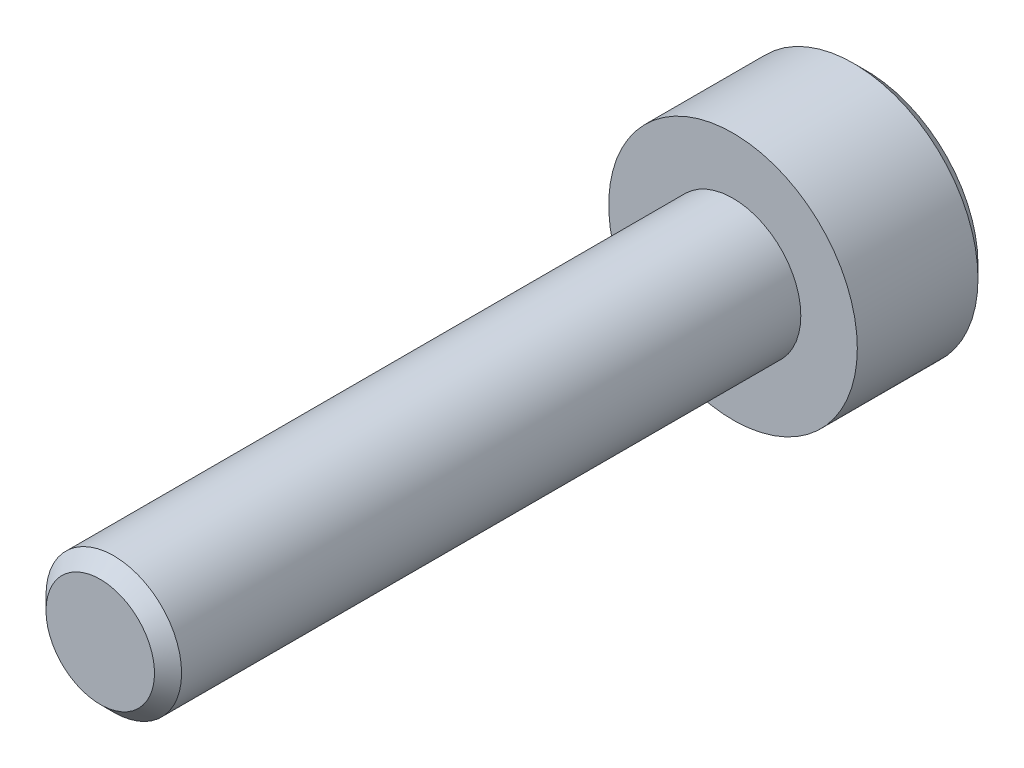
ISO-10303-21;
HEADER;
FILE_DESCRIPTION(('STEP AP214'),'2;1');
FILE_NAME('part.step','',(''),(''),'','','');
FILE_SCHEMA(('AUTOMOTIVE_DESIGN { 1 0 10303 214 1 1 1 1 }'));
ENDSEC;
DATA;
#1=APPLICATION_CONTEXT('core data for automotive mechanical design processes');
#2=APPLICATION_PROTOCOL_DEFINITION('international standard','automotive_design',2000,#1);
#3=PRODUCT_CONTEXT('',#1,'mechanical');
#4=PRODUCT('Part','Part','',(#3));
#5=PRODUCT_RELATED_PRODUCT_CATEGORY('part','',(#4));
#6=PRODUCT_DEFINITION_FORMATION('','',#4);
#7=PRODUCT_DEFINITION_CONTEXT('part definition',#1,'design');
#8=PRODUCT_DEFINITION('design','',#6,#7);
#9=PRODUCT_DEFINITION_SHAPE('','',#8);
#10=(LENGTH_UNIT() NAMED_UNIT(*) SI_UNIT(.MILLI.,.METRE.));
#11=(NAMED_UNIT(*) PLANE_ANGLE_UNIT() SI_UNIT($,.RADIAN.));
#12=(NAMED_UNIT(*) SI_UNIT($,.STERADIAN.) SOLID_ANGLE_UNIT());
#13=UNCERTAINTY_MEASURE_WITH_UNIT(LENGTH_MEASURE(1.E-05),#10,'distance_accuracy_value','');
#14=(GEOMETRIC_REPRESENTATION_CONTEXT(3) GLOBAL_UNCERTAINTY_ASSIGNED_CONTEXT((#13)) GLOBAL_UNIT_ASSIGNED_CONTEXT((#10,
#11,#12)) REPRESENTATION_CONTEXT('',''));
#15=CARTESIAN_POINT('',(0.,0.,0.));
#16=DIRECTION('',(0.,0.,1.));
#17=DIRECTION('',(1.,0.,0.));
#18=AXIS2_PLACEMENT_3D('',#15,#16,#17);
#19=CARTESIAN_POINT('',(0.,0.,-1.445));
#20=DIRECTION('',(0.,0.,1.));
#21=DIRECTION('',(1.,0.,0.));
#22=AXIS2_PLACEMENT_3D('',#19,#20,#21);
#23=PLANE('',#22);
#24=DIRECTION('',(0.,1.,0.));
#25=VECTOR('',#24,1.);
#26=CARTESIAN_POINT('',(1.25,0.721687836487032,-1.445));
#27=LINE('',#26,#25);
#28=CARTESIAN_POINT('',(1.25,0.72168783648703,-1.445));
#29=VERTEX_POINT('',#28);
#30=CARTESIAN_POINT('',(1.25,-0.721687836487032,-1.445));
#31=VERTEX_POINT('',#30);
#32=EDGE_CURVE('E130',#29,#31,#27,.F.);
#33=ORIENTED_EDGE('',*,*,#32,.T.);
#34=DIRECTION('',(0.866025403784439,0.499999999999999,0.));
#35=VECTOR('',#34,1.);
#36=CARTESIAN_POINT('',(1.25,-0.721687836487032,-1.445));
#37=LINE('',#36,#35);
#38=CARTESIAN_POINT('',(0.,-1.44337567297406,-1.445));
#39=VERTEX_POINT('',#38);
#40=EDGE_CURVE('E125',#31,#39,#37,.F.);
#41=ORIENTED_EDGE('',*,*,#40,.T.);
#42=DIRECTION('',(0.866025403784438,-0.5,0.));
#43=VECTOR('',#42,1.);
#44=CARTESIAN_POINT('',(0.,-1.44337567297406,-1.445));
#45=LINE('',#44,#43);
#46=CARTESIAN_POINT('',(-1.25,-0.721687836487031,-1.445));
#47=VERTEX_POINT('',#46);
#48=EDGE_CURVE('E74',#39,#47,#45,.F.);
#49=ORIENTED_EDGE('',*,*,#48,.T.);
#50=DIRECTION('',(0.,1.,0.));
#51=VECTOR('',#50,1.);
#52=CARTESIAN_POINT('',(-1.25,-0.721687836487032,-1.445));
#53=LINE('',#52,#51);
#54=CARTESIAN_POINT('',(-1.25,0.721687836487033,-1.445));
#55=VERTEX_POINT('',#54);
#56=EDGE_CURVE('E71',#47,#55,#53,.T.);
#57=ORIENTED_EDGE('',*,*,#56,.T.);
#58=DIRECTION('',(-0.866025403784439,-0.5,0.));
#59=VECTOR('',#58,1.);
#60=CARTESIAN_POINT('',(-1.25,0.721687836487033,-1.445));
#61=LINE('',#60,#59);
#62=CARTESIAN_POINT('',(0.,1.44337567297406,-1.445));
#63=VERTEX_POINT('',#62);
#64=EDGE_CURVE('E68',#55,#63,#61,.F.);
#65=ORIENTED_EDGE('',*,*,#64,.T.);
#66=DIRECTION('',(-0.866025403784439,0.5,0.));
#67=VECTOR('',#66,1.);
#68=CARTESIAN_POINT('',(0.,1.44337567297406,-1.445));
#69=LINE('',#68,#67);
#70=EDGE_CURVE('E91',#63,#29,#69,.F.);
#71=ORIENTED_EDGE('',*,*,#70,.T.);
#72=EDGE_LOOP('',(#33,#41,#49,#57,#65,#71));
#73=FACE_BOUND('',#72,.T.);
#74=ADVANCED_FACE('F17',(#73),#23,.F.);
#75=CARTESIAN_POINT('',(-1.25,-0.721687836487032,-2.945));
#76=DIRECTION('',(-1.,0.,0.));
#77=DIRECTION('',(0.,0.,1.));
#78=AXIS2_PLACEMENT_3D('',#75,#76,#77);
#79=PLANE('',#78);
#80=ORIENTED_EDGE('',*,*,#56,.F.);
#81=DIRECTION('',(0.,0.,1.));
#82=VECTOR('',#81,1.);
#83=CARTESIAN_POINT('',(-1.25,-0.721687836487029,-2.945));
#84=LINE('',#83,#82);
#85=CARTESIAN_POINT('',(-1.25,-0.721687836487031,-2.945));
#86=VERTEX_POINT('',#85);
#87=EDGE_CURVE('E120',#47,#86,#84,.F.);
#88=ORIENTED_EDGE('',*,*,#87,.T.);
#89=DIRECTION('',(0.,1.,0.));
#90=VECTOR('',#89,1.);
#91=CARTESIAN_POINT('',(-1.25,0.,-2.945));
#92=LINE('',#91,#90);
#93=CARTESIAN_POINT('',(-1.25,0.721687836487033,-2.945));
#94=VERTEX_POINT('',#93);
#95=EDGE_CURVE('E82',#86,#94,#92,.T.);
#96=ORIENTED_EDGE('',*,*,#95,.T.);
#97=DIRECTION('',(0.,0.,1.));
#98=VECTOR('',#97,1.);
#99=CARTESIAN_POINT('',(-1.25,0.721687836487033,-2.945));
#100=LINE('',#99,#98);
#101=EDGE_CURVE('E77',#94,#55,#100,.T.);
#102=ORIENTED_EDGE('',*,*,#101,.T.);
#103=EDGE_LOOP('',(#80,#88,#96,#102));
#104=FACE_BOUND('',#103,.T.);
#105=ADVANCED_FACE('F80',(#104),#79,.F.);
#106=CARTESIAN_POINT('',(-1.25,0.721687836487033,-2.945));
#107=DIRECTION('',(-0.5,0.866025403784439,0.));
#108=DIRECTION('',(-0.866025403784439,-0.5,0.));
#109=AXIS2_PLACEMENT_3D('',#106,#107,#108);
#110=PLANE('',#109);
#111=ORIENTED_EDGE('',*,*,#64,.F.);
#112=ORIENTED_EDGE('',*,*,#101,.F.);
#113=DIRECTION('',(0.86602540378444,0.499999999999998,0.));
#114=VECTOR('',#113,1.);
#115=CARTESIAN_POINT('',(-1.25,0.721687836487032,-2.945));
#116=LINE('',#115,#114);
#117=CARTESIAN_POINT('',(0.,1.44337567297406,-2.945));
#118=VERTEX_POINT('',#117);
#119=EDGE_CURVE('E117',#94,#118,#116,.T.);
#120=ORIENTED_EDGE('',*,*,#119,.T.);
#121=DIRECTION('',(0.,0.,1.));
#122=VECTOR('',#121,1.);
#123=CARTESIAN_POINT('',(0.,1.44337567297406,-2.945));
#124=LINE('',#123,#122);
#125=EDGE_CURVE('E88',#118,#63,#124,.T.);
#126=ORIENTED_EDGE('',*,*,#125,.T.);
#127=EDGE_LOOP('',(#111,#112,#120,#126));
#128=FACE_BOUND('',#127,.T.);
#129=ADVANCED_FACE('F86',(#128),#110,.F.);
#130=CARTESIAN_POINT('',(0.,1.44337567297406,-2.945));
#131=DIRECTION('',(0.5,0.866025403784439,0.));
#132=DIRECTION('',(-0.866025403784439,0.5,0.));
#133=AXIS2_PLACEMENT_3D('',#130,#131,#132);
#134=PLANE('',#133);
#135=ORIENTED_EDGE('',*,*,#70,.F.);
#136=ORIENTED_EDGE('',*,*,#125,.F.);
#137=DIRECTION('',(0.86602540378444,-0.499999999999998,0.));
#138=VECTOR('',#137,1.);
#139=CARTESIAN_POINT('',(0.,1.44337567297406,-2.945));
#140=LINE('',#139,#138);
#141=CARTESIAN_POINT('',(1.25,0.721687836487031,-2.945));
#142=VERTEX_POINT('',#141);
#143=EDGE_CURVE('E115',#118,#142,#140,.T.);
#144=ORIENTED_EDGE('',*,*,#143,.T.);
#145=DIRECTION('',(0.,0.,-1.));
#146=VECTOR('',#145,1.);
#147=CARTESIAN_POINT('',(1.25,0.721687836487032,-2.945));
#148=LINE('',#147,#146);
#149=EDGE_CURVE('E132',#142,#29,#148,.F.);
#150=ORIENTED_EDGE('',*,*,#149,.T.);
#151=EDGE_LOOP('',(#135,#136,#144,#150));
#152=FACE_BOUND('',#151,.T.);
#153=ADVANCED_FACE('F137',(#152),#134,.F.);
#154=CARTESIAN_POINT('',(1.25,0.721687836487032,-2.945));
#155=DIRECTION('',(1.,0.,0.));
#156=DIRECTION('',(0.,0.,-1.));
#157=AXIS2_PLACEMENT_3D('',#154,#155,#156);
#158=PLANE('',#157);
#159=ORIENTED_EDGE('',*,*,#32,.F.);
#160=ORIENTED_EDGE('',*,*,#149,.F.);
#161=DIRECTION('',(0.,1.,0.));
#162=VECTOR('',#161,1.);
#163=CARTESIAN_POINT('',(1.25,0.,-2.945));
#164=LINE('',#163,#162);
#165=CARTESIAN_POINT('',(1.25,-0.721687836487032,-2.945));
#166=VERTEX_POINT('',#165);
#167=EDGE_CURVE('E113',#142,#166,#164,.F.);
#168=ORIENTED_EDGE('',*,*,#167,.T.);
#169=DIRECTION('',(0.,0.,1.));
#170=VECTOR('',#169,1.);
#171=CARTESIAN_POINT('',(1.25,-0.721687836487032,-2.945));
#172=LINE('',#171,#170);
#173=EDGE_CURVE('E127',#166,#31,#172,.T.);
#174=ORIENTED_EDGE('',*,*,#173,.T.);
#175=EDGE_LOOP('',(#159,#160,#168,#174));
#176=FACE_BOUND('',#175,.T.);
#177=ADVANCED_FACE('F141',(#176),#158,.F.);
#178=CARTESIAN_POINT('',(1.25,-0.721687836487032,-2.945));
#179=DIRECTION('',(0.499999999999999,-0.866025403784439,0.));
#180=DIRECTION('',(0.866025403784439,0.499999999999999,0.));
#181=AXIS2_PLACEMENT_3D('',#178,#179,#180);
#182=PLANE('',#181);
#183=ORIENTED_EDGE('',*,*,#40,.F.);
#184=ORIENTED_EDGE('',*,*,#173,.F.);
#185=DIRECTION('',(-0.86602540378444,-0.499999999999998,0.));
#186=VECTOR('',#185,1.);
#187=CARTESIAN_POINT('',(1.25,-0.721687836487032,-2.945));
#188=LINE('',#187,#186);
#189=CARTESIAN_POINT('',(0.,-1.44337567297406,-2.945));
#190=VERTEX_POINT('',#189);
#191=EDGE_CURVE('E35',#166,#190,#188,.T.);
#192=ORIENTED_EDGE('',*,*,#191,.T.);
#193=DIRECTION('',(0.,0.,1.));
#194=VECTOR('',#193,1.);
#195=CARTESIAN_POINT('',(0.,-1.44337567297406,-2.945));
#196=LINE('',#195,#194);
#197=EDGE_CURVE('E123',#190,#39,#196,.T.);
#198=ORIENTED_EDGE('',*,*,#197,.T.);
#199=EDGE_LOOP('',(#183,#184,#192,#198));
#200=FACE_BOUND('',#199,.T.);
#201=ADVANCED_FACE('F143',(#200),#182,.F.);
#202=CARTESIAN_POINT('',(0.,-1.44337567297406,-2.945));
#203=DIRECTION('',(-0.5,-0.866025403784438,0.));
#204=DIRECTION('',(0.866025403784438,-0.5,0.));
#205=AXIS2_PLACEMENT_3D('',#202,#203,#204);
#206=PLANE('',#205);
#207=ORIENTED_EDGE('',*,*,#48,.F.);
#208=ORIENTED_EDGE('',*,*,#197,.F.);
#209=DIRECTION('',(-0.86602540378444,0.499999999999998,0.));
#210=VECTOR('',#209,1.);
#211=CARTESIAN_POINT('',(0.,-1.44337567297406,-2.945));
#212=LINE('',#211,#210);
#213=EDGE_CURVE('E107',#190,#86,#212,.T.);
#214=ORIENTED_EDGE('',*,*,#213,.T.);
#215=ORIENTED_EDGE('',*,*,#87,.F.);
#216=EDGE_LOOP('',(#207,#208,#214,#215));
#217=FACE_BOUND('',#216,.T.);
#218=ADVANCED_FACE('F146',(#217),#206,.F.);
#219=CARTESIAN_POINT('',(0.,0.,-2.945));
#220=DIRECTION('',(0.,0.,1.));
#221=DIRECTION('',(1.,0.,0.));
#222=AXIS2_PLACEMENT_3D('',#219,#220,#221);
#223=PLANE('',#222);
#224=ORIENTED_EDGE('',*,*,#191,.F.);
#225=ORIENTED_EDGE('',*,*,#167,.F.);
#226=ORIENTED_EDGE('',*,*,#143,.F.);
#227=ORIENTED_EDGE('',*,*,#119,.F.);
#228=ORIENTED_EDGE('',*,*,#95,.F.);
#229=ORIENTED_EDGE('',*,*,#213,.F.);
#230=EDGE_LOOP('',(#224,#225,#226,#227,#228,#229));
#231=FACE_BOUND('',#230,.T.);
#232=CARTESIAN_POINT('',(0.,0.,-2.94499999995423));
#233=DIRECTION('',(0.,0.,1.));
#234=DIRECTION('',(1.,0.,0.));
#235=AXIS2_PLACEMENT_3D('',#232,#233,#234);
#236=CIRCLE('',#235,2.47500000006085);
#237=CARTESIAN_POINT('',(2.47500000006085,0.,-2.94499999995423));
#238=VERTEX_POINT('',#237);
#239=EDGE_CURVE('E20',#238,#238,#236,.T.);
#240=ORIENTED_EDGE('',*,*,#239,.F.);
#241=EDGE_LOOP('',(#240));
#242=FACE_BOUND('',#241,.T.);
#243=ADVANCED_FACE('F148',(#231,#242),#223,.F.);
#244=CARTESIAN_POINT('',(0.,0.,-2.66999999996642));
#245=DIRECTION('',(0.,0.,1.));
#246=DIRECTION('',(1.,0.,0.));
#247=AXIS2_PLACEMENT_3D('',#244,#245,#246);
#248=CONICAL_SURFACE('',#247,2.75000000004866,0.785398163397448);
#249=ORIENTED_EDGE('',*,*,#239,.T.);
#250=EDGE_LOOP('',(#249));
#251=FACE_BOUND('',#250,.T.);
#252=CARTESIAN_POINT('',(0.,0.,-2.67));
#253=DIRECTION('',(0.,0.,1.));
#254=DIRECTION('',(1.,0.,0.));
#255=AXIS2_PLACEMENT_3D('',#252,#253,#254);
#256=CIRCLE('',#255,2.75);
#257=CARTESIAN_POINT('',(2.75,0.,-2.67));
#258=VERTEX_POINT('',#257);
#259=EDGE_CURVE('E99',#258,#258,#256,.T.);
#260=ORIENTED_EDGE('',*,*,#259,.F.);
#261=EDGE_LOOP('',(#260));
#262=FACE_BOUND('',#261,.T.);
#263=ADVANCED_FACE('F151',(#251,#262),#248,.T.);
#264=CARTESIAN_POINT('',(0.,0.,14.));
#265=DIRECTION('',(0.,0.,1.));
#266=DIRECTION('',(1.,0.,0.));
#267=AXIS2_PLACEMENT_3D('',#264,#265,#266);
#268=PLANE('',#267);
#269=CARTESIAN_POINT('',(0.,0.,14.00000000001));
#270=DIRECTION('',(0.,0.,-1.));
#271=DIRECTION('',(-1.,0.,0.));
#272=AXIS2_PLACEMENT_3D('',#269,#270,#271);
#273=CIRCLE('',#272,1.19999999998299);
#274=CARTESIAN_POINT('',(-1.19999999998299,0.,14.00000000001));
#275=VERTEX_POINT('',#274);
#276=EDGE_CURVE('E97',#275,#275,#273,.T.);
#277=ORIENTED_EDGE('',*,*,#276,.F.);
#278=EDGE_LOOP('',(#277));
#279=FACE_BOUND('',#278,.T.);
#280=ADVANCED_FACE('F157',(#279),#268,.T.);
#281=CARTESIAN_POINT('',(0.,0.,-2.945));
#282=DIRECTION('',(0.,0.,1.));
#283=DIRECTION('',(1.,0.,0.));
#284=AXIS2_PLACEMENT_3D('',#281,#282,#283);
#285=CYLINDRICAL_SURFACE('',#284,2.75);
#286=ORIENTED_EDGE('',*,*,#259,.T.);
#287=EDGE_LOOP('',(#286));
#288=FACE_BOUND('',#287,.T.);
#289=CARTESIAN_POINT('',(0.,0.,0.));
#290=DIRECTION('',(0.,0.,1.));
#291=DIRECTION('',(1.,0.,0.));
#292=AXIS2_PLACEMENT_3D('',#289,#290,#291);
#293=CIRCLE('',#292,2.75);
#294=CARTESIAN_POINT('',(2.75,0.,0.));
#295=VERTEX_POINT('',#294);
#296=EDGE_CURVE('E95',#295,#295,#293,.T.);
#297=ORIENTED_EDGE('',*,*,#296,.F.);
#298=EDGE_LOOP('',(#297));
#299=FACE_BOUND('',#298,.T.);
#300=ADVANCED_FACE('F163',(#288,#299),#285,.T.);
#301=CARTESIAN_POINT('',(0.,0.,13.7000000000285));
#302=DIRECTION('',(0.,0.,-1.));
#303=DIRECTION('',(-1.,0.,0.));
#304=AXIS2_PLACEMENT_3D('',#301,#302,#303);
#305=CONICAL_SURFACE('',#304,1.49999999996453,0.785398163397448);
#306=CARTESIAN_POINT('',(0.,0.,13.7));
#307=DIRECTION('',(0.,0.,1.));
#308=DIRECTION('',(1.,0.,0.));
#309=AXIS2_PLACEMENT_3D('',#306,#307,#308);
#310=CIRCLE('',#309,1.5);
#311=CARTESIAN_POINT('',(1.5,0.,13.7));
#312=VERTEX_POINT('',#311);
#313=EDGE_CURVE('E26',#312,#312,#310,.F.);
#314=ORIENTED_EDGE('',*,*,#313,.F.);
#315=EDGE_LOOP('',(#314));
#316=FACE_BOUND('',#315,.T.);
#317=ORIENTED_EDGE('',*,*,#276,.T.);
#318=EDGE_LOOP('',(#317));
#319=FACE_BOUND('',#318,.T.);
#320=ADVANCED_FACE('F174',(#316,#319),#305,.T.);
#321=CARTESIAN_POINT('',(0.,0.,0.));
#322=DIRECTION('',(0.,0.,1.));
#323=DIRECTION('',(1.,0.,0.));
#324=AXIS2_PLACEMENT_3D('',#321,#322,#323);
#325=PLANE('',#324);
#326=CARTESIAN_POINT('',(0.,0.,0.));
#327=DIRECTION('',(0.,0.,1.));
#328=DIRECTION('',(1.,0.,0.));
#329=AXIS2_PLACEMENT_3D('',#326,#327,#328);
#330=CIRCLE('',#329,1.5);
#331=CARTESIAN_POINT('',(1.5,0.,0.));
#332=VERTEX_POINT('',#331);
#333=EDGE_CURVE('E11',#332,#332,#330,.T.);
#334=ORIENTED_EDGE('',*,*,#333,.F.);
#335=EDGE_LOOP('',(#334));
#336=FACE_BOUND('',#335,.T.);
#337=ORIENTED_EDGE('',*,*,#296,.T.);
#338=EDGE_LOOP('',(#337));
#339=FACE_BOUND('',#338,.T.);
#340=ADVANCED_FACE('F168',(#336,#339),#325,.T.);
#341=CARTESIAN_POINT('',(0.,0.,0.));
#342=DIRECTION('',(0.,0.,1.));
#343=DIRECTION('',(1.,0.,0.));
#344=AXIS2_PLACEMENT_3D('',#341,#342,#343);
#345=CYLINDRICAL_SURFACE('',#344,1.5);
#346=ORIENTED_EDGE('',*,*,#333,.T.);
#347=EDGE_LOOP('',(#346));
#348=FACE_BOUND('',#347,.T.);
#349=ORIENTED_EDGE('',*,*,#313,.T.);
#350=EDGE_LOOP('',(#349));
#351=FACE_BOUND('',#350,.T.);
#352=ADVANCED_FACE('F166',(#348,#351),#345,.T.);
#353=CLOSED_SHELL('',(#74,#105,#129,#153,#177,#201,#218,#243,#263,#280,#300,#320,#340,#352));
#354=MANIFOLD_SOLID_BREP('B1',#353);
#355=ADVANCED_BREP_SHAPE_REPRESENTATION('',(#18,#354),#14);
#356=SHAPE_DEFINITION_REPRESENTATION(#9,#355);
ENDSEC;
END-ISO-10303-21;
